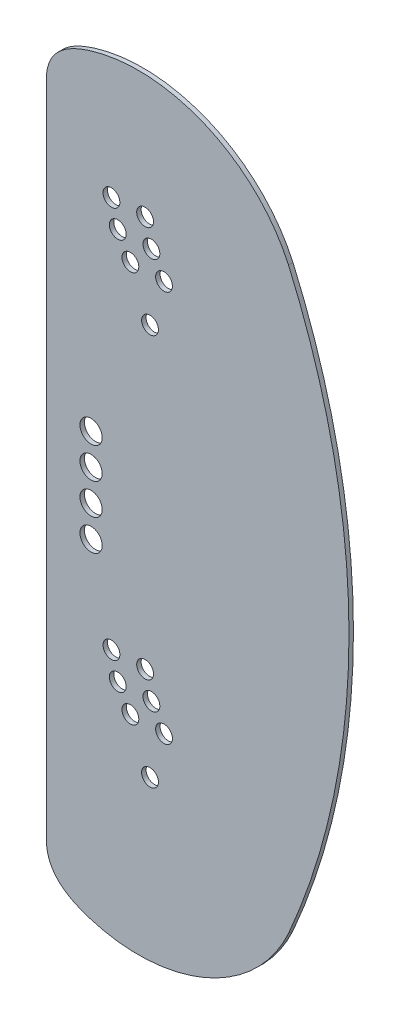
ISO-10303-21;
HEADER;
FILE_DESCRIPTION(('STEP AP214'),'2;1');
FILE_NAME('part.step','',(''),(''),'','','');
FILE_SCHEMA(('AUTOMOTIVE_DESIGN { 1 0 10303 214 1 1 1 1 }'));
ENDSEC;
DATA;
#1=APPLICATION_CONTEXT('core data for automotive mechanical design processes');
#2=APPLICATION_PROTOCOL_DEFINITION('international standard','automotive_design',2000,#1);
#3=PRODUCT_CONTEXT('',#1,'mechanical');
#4=PRODUCT('Part','Part','',(#3));
#5=PRODUCT_RELATED_PRODUCT_CATEGORY('part','',(#4));
#6=PRODUCT_DEFINITION_FORMATION('','',#4);
#7=PRODUCT_DEFINITION_CONTEXT('part definition',#1,'design');
#8=PRODUCT_DEFINITION('design','',#6,#7);
#9=PRODUCT_DEFINITION_SHAPE('','',#8);
#10=(LENGTH_UNIT() NAMED_UNIT(*) SI_UNIT(.MILLI.,.METRE.));
#11=(NAMED_UNIT(*) PLANE_ANGLE_UNIT() SI_UNIT($,.RADIAN.));
#12=(NAMED_UNIT(*) SI_UNIT($,.STERADIAN.) SOLID_ANGLE_UNIT());
#13=UNCERTAINTY_MEASURE_WITH_UNIT(LENGTH_MEASURE(1.E-05),#10,'distance_accuracy_value','');
#14=(GEOMETRIC_REPRESENTATION_CONTEXT(3) GLOBAL_UNCERTAINTY_ASSIGNED_CONTEXT((#13)) GLOBAL_UNIT_ASSIGNED_CONTEXT((#10,
#11,#12)) REPRESENTATION_CONTEXT('',''));
#15=CARTESIAN_POINT('',(0.,0.,0.));
#16=DIRECTION('',(0.,0.,1.));
#17=DIRECTION('',(1.,0.,0.));
#18=AXIS2_PLACEMENT_3D('',#15,#16,#17);
#19=CARTESIAN_POINT('',(1361.09656167217,1948.86349417425,6.35));
#20=CARTESIAN_POINT('',(1364.40082784819,1984.02317107155,6.35));
#21=CARTESIAN_POINT('',(1498.61321106589,2056.46227725234,6.35));
#22=CARTESIAN_POINT('',(1658.30760281048,1990.65488029267,6.35));
#23=CARTESIAN_POINT('',(1706.23606502377,1885.5492461219,6.35));
#24=B_SPLINE_CURVE_WITH_KNOTS('',3,(#19,#20,#21,#22,#23),.UNSPECIFIED.,.F.,.F.,(4,1,4),(0.,
0.219674410916332,1.),.UNSPECIFIED.);
#25=DIRECTION('',(0.,0.,-1.));
#26=VECTOR('',#25,1.);
#27=SURFACE_OF_LINEAR_EXTRUSION('',#24,#26);
#28=CARTESIAN_POINT('',(1361.09656167217,1948.86349417425,0.));
#29=CARTESIAN_POINT('',(1364.40082784819,1984.02317107155,0.));
#30=CARTESIAN_POINT('',(1498.61321106589,2056.46227725234,0.));
#31=CARTESIAN_POINT('',(1658.30760281048,1990.65488029267,0.));
#32=CARTESIAN_POINT('',(1706.23606502377,1885.5492461219,0.));
#33=B_SPLINE_CURVE_WITH_KNOTS('',3,(#28,#29,#30,#31,#32),.UNSPECIFIED.,.F.,.F.,(4,1,4),(0.,
0.219674410916332,1.),.UNSPECIFIED.);
#34=CARTESIAN_POINT('',(1361.09656167217,1948.86349417425,0.));
#35=VERTEX_POINT('',#34);
#36=CARTESIAN_POINT('',(1706.23606502377,1885.5492461219,0.));
#37=VERTEX_POINT('',#36);
#38=EDGE_CURVE('E116',#35,#37,#33,.T.);
#39=ORIENTED_EDGE('',*,*,#38,.F.);
#40=DIRECTION('',(0.,0.,-1.));
#41=VECTOR('',#40,1.);
#42=CARTESIAN_POINT('',(1361.09656167217,1948.86349417425,6.35));
#43=LINE('',#42,#41);
#44=CARTESIAN_POINT('',(1361.09656167217,1948.86349417425,6.35));
#45=VERTEX_POINT('',#44);
#46=EDGE_CURVE('E11',#45,#35,#43,.T.);
#47=ORIENTED_EDGE('',*,*,#46,.F.);
#48=CARTESIAN_POINT('',(1706.23606502377,1885.5492461219,6.35));
#49=VERTEX_POINT('',#48);
#50=EDGE_CURVE('E85',#45,#49,#24,.T.);
#51=ORIENTED_EDGE('',*,*,#50,.T.);
#52=DIRECTION('',(0.,0.,-1.));
#53=VECTOR('',#52,1.);
#54=CARTESIAN_POINT('',(1706.23606502377,1885.5492461219,6.35));
#55=LINE('',#54,#53);
#56=EDGE_CURVE('E73',#49,#37,#55,.T.);
#57=ORIENTED_EDGE('',*,*,#56,.T.);
#58=EDGE_LOOP('',(#39,#47,#51,#57));
#59=FACE_BOUND('',#58,.T.);
#60=ADVANCED_FACE('F33',(#59),#27,.T.);
#61=CARTESIAN_POINT('',(1361.09656167217,0.,6.35));
#62=DIRECTION('',(1.,0.,0.));
#63=DIRECTION('',(0.,0.,-1.));
#64=AXIS2_PLACEMENT_3D('',#61,#62,#63);
#65=PLANE('',#64);
#66=DIRECTION('',(0.,-1.,0.));
#67=VECTOR('',#66,1.);
#68=CARTESIAN_POINT('',(1361.09656167217,0.,0.));
#69=LINE('',#68,#67);
#70=CARTESIAN_POINT('',(1361.09656167217,996.36349417552,0.));
#71=VERTEX_POINT('',#70);
#72=EDGE_CURVE('E90',#35,#71,#69,.T.);
#73=ORIENTED_EDGE('',*,*,#72,.T.);
#74=DIRECTION('',(0.,0.,-1.));
#75=VECTOR('',#74,1.);
#76=CARTESIAN_POINT('',(1361.09656167217,996.36349417552,6.35));
#77=LINE('',#76,#75);
#78=CARTESIAN_POINT('',(1361.09656167217,996.36349417552,6.35));
#79=VERTEX_POINT('',#78);
#80=EDGE_CURVE('E42',#79,#71,#77,.T.);
#81=ORIENTED_EDGE('',*,*,#80,.F.);
#82=DIRECTION('',(0.,-1.,0.));
#83=VECTOR('',#82,1.);
#84=CARTESIAN_POINT('',(1361.09656167217,0.,6.35));
#85=LINE('',#84,#83);
#86=EDGE_CURVE('E79',#45,#79,#85,.T.);
#87=ORIENTED_EDGE('',*,*,#86,.F.);
#88=ORIENTED_EDGE('',*,*,#46,.T.);
#89=EDGE_LOOP('',(#73,#81,#87,#88));
#90=FACE_BOUND('',#89,.T.);
#91=ADVANCED_FACE('F88',(#90),#65,.F.);
#92=CARTESIAN_POINT('',(1361.09656167217,996.36349417552,6.35));
#93=CARTESIAN_POINT('',(1364.40082784819,961.20381727822,6.35));
#94=CARTESIAN_POINT('',(1498.61321106589,888.764711097435,6.35));
#95=CARTESIAN_POINT('',(1658.30760281048,954.572108057104,6.35));
#96=CARTESIAN_POINT('',(1706.23606502377,1059.67774222787,6.35));
#97=B_SPLINE_CURVE_WITH_KNOTS('',3,(#92,#93,#94,#95,#96),.UNSPECIFIED.,.F.,.F.,(4,1,4),(0.,
0.219674410916332,1.),.UNSPECIFIED.);
#98=DIRECTION('',(0.,0.,-1.));
#99=VECTOR('',#98,1.);
#100=SURFACE_OF_LINEAR_EXTRUSION('',#97,#99);
#101=CARTESIAN_POINT('',(1361.09656167217,996.36349417552,0.));
#102=CARTESIAN_POINT('',(1364.40082784819,961.20381727822,0.));
#103=CARTESIAN_POINT('',(1498.61321106589,888.764711097435,0.));
#104=CARTESIAN_POINT('',(1658.30760281048,954.572108057104,0.));
#105=CARTESIAN_POINT('',(1706.23606502377,1059.67774222787,0.));
#106=B_SPLINE_CURVE_WITH_KNOTS('',3,(#101,#102,#103,#104,#105),.UNSPECIFIED.,.F.,.F.,(4,1,4),
(0.,0.219674410916332,1.),.UNSPECIFIED.);
#107=CARTESIAN_POINT('',(1706.23606502377,1059.67774222787,0.));
#108=VERTEX_POINT('',#107);
#109=EDGE_CURVE('E66',#71,#108,#106,.T.);
#110=ORIENTED_EDGE('',*,*,#109,.T.);
#111=DIRECTION('',(0.,0.,-1.));
#112=VECTOR('',#111,1.);
#113=CARTESIAN_POINT('',(1706.23606502377,1059.67774222787,6.35));
#114=LINE('',#113,#112);
#115=CARTESIAN_POINT('',(1706.23606502377,1059.67774222787,6.35));
#116=VERTEX_POINT('',#115);
#117=EDGE_CURVE('E91',#116,#108,#114,.T.);
#118=ORIENTED_EDGE('',*,*,#117,.F.);
#119=EDGE_CURVE('E84',#79,#116,#97,.T.);
#120=ORIENTED_EDGE('',*,*,#119,.F.);
#121=ORIENTED_EDGE('',*,*,#80,.T.);
#122=EDGE_LOOP('',(#110,#118,#120,#121));
#123=FACE_BOUND('',#122,.T.);
#124=ADVANCED_FACE('F92',(#123),#100,.F.);
#125=CARTESIAN_POINT('',(1462.66490862887,1248.81453875202,6.35));
#126=DIRECTION('',(0.,0.,-1.));
#127=DIRECTION('',(-1.,0.,0.));
#128=AXIS2_PLACEMENT_3D('',#125,#126,#127);
#129=CYLINDRICAL_SURFACE('',#128,12.0000014000006);
#130=CARTESIAN_POINT('',(1462.66490862887,1248.81453875202,6.35));
#131=DIRECTION('',(0.,0.,1.));
#132=DIRECTION('',(1.,0.,0.));
#133=AXIS2_PLACEMENT_3D('',#130,#131,#132);
#134=CIRCLE('',#133,12.0000014000006);
#135=CARTESIAN_POINT('',(1474.66491002887,1248.81453875202,6.35));
#136=VERTEX_POINT('',#135);
#137=EDGE_CURVE('E360',#136,#136,#134,.T.);
#138=ORIENTED_EDGE('',*,*,#137,.T.);
#139=EDGE_LOOP('',(#138));
#140=FACE_BOUND('',#139,.T.);
#141=CARTESIAN_POINT('',(1462.66490862887,1248.81453875202,0.));
#142=DIRECTION('',(0.,0.,1.));
#143=DIRECTION('',(1.,0.,0.));
#144=AXIS2_PLACEMENT_3D('',#141,#142,#143);
#145=CIRCLE('',#144,12.0000014000006);
#146=CARTESIAN_POINT('',(1474.66491002887,1248.81453875202,0.));
#147=VERTEX_POINT('',#146);
#148=EDGE_CURVE('E186',#147,#147,#145,.T.);
#149=ORIENTED_EDGE('',*,*,#148,.F.);
#150=EDGE_LOOP('',(#149));
#151=FACE_BOUND('',#150,.T.);
#152=ADVANCED_FACE('F106',(#140,#151),#129,.F.);
#153=CARTESIAN_POINT('',(1508.66437512587,1153.81451282817,6.35));
#154=DIRECTION('',(0.,0.,-1.));
#155=DIRECTION('',(-1.,0.,0.));
#156=AXIS2_PLACEMENT_3D('',#153,#154,#155);
#157=CYLINDRICAL_SURFACE('',#156,12.0000014);
#158=CARTESIAN_POINT('',(1508.66437512587,1153.81451282817,6.35));
#159=DIRECTION('',(0.,0.,1.));
#160=DIRECTION('',(1.,0.,0.));
#161=AXIS2_PLACEMENT_3D('',#158,#159,#160);
#162=CIRCLE('',#161,12.0000014);
#163=CARTESIAN_POINT('',(1520.66437652587,1153.81451282817,6.35));
#164=VERTEX_POINT('',#163);
#165=EDGE_CURVE('E358',#164,#164,#162,.T.);
#166=ORIENTED_EDGE('',*,*,#165,.T.);
#167=EDGE_LOOP('',(#166));
#168=FACE_BOUND('',#167,.T.);
#169=CARTESIAN_POINT('',(1508.66437512587,1153.81451282817,0.));
#170=DIRECTION('',(0.,0.,1.));
#171=DIRECTION('',(1.,0.,0.));
#172=AXIS2_PLACEMENT_3D('',#169,#170,#171);
#173=CIRCLE('',#172,12.0000014);
#174=CARTESIAN_POINT('',(1520.66437652587,1153.81451282817,0.));
#175=VERTEX_POINT('',#174);
#176=EDGE_CURVE('E183',#175,#175,#173,.T.);
#177=ORIENTED_EDGE('',*,*,#176,.F.);
#178=EDGE_LOOP('',(#177));
#179=FACE_BOUND('',#178,.T.);
#180=ADVANCED_FACE('F248',(#168,#179),#157,.F.);
#181=CARTESIAN_POINT('',(1508.66437512587,1712.61451282817,6.35));
#182=DIRECTION('',(0.,0.,-1.));
#183=DIRECTION('',(-1.,0.,0.));
#184=AXIS2_PLACEMENT_3D('',#181,#182,#183);
#185=CYLINDRICAL_SURFACE('',#184,12.0000014);
#186=CARTESIAN_POINT('',(1508.66437512587,1712.61451282817,6.35));
#187=DIRECTION('',(0.,0.,1.));
#188=DIRECTION('',(1.,0.,0.));
#189=AXIS2_PLACEMENT_3D('',#186,#187,#188);
#190=CIRCLE('',#189,12.0000014);
#191=CARTESIAN_POINT('',(1520.66437652587,1712.61451282817,6.35));
#192=VERTEX_POINT('',#191);
#193=EDGE_CURVE('E355',#192,#192,#190,.T.);
#194=ORIENTED_EDGE('',*,*,#193,.T.);
#195=EDGE_LOOP('',(#194));
#196=FACE_BOUND('',#195,.T.);
#197=CARTESIAN_POINT('',(1508.66437512587,1712.61451282817,0.));
#198=DIRECTION('',(0.,0.,1.));
#199=DIRECTION('',(1.,0.,0.));
#200=AXIS2_PLACEMENT_3D('',#197,#198,#199);
#201=CIRCLE('',#200,12.0000014);
#202=CARTESIAN_POINT('',(1520.66437652587,1712.61451282817,0.));
#203=VERTEX_POINT('',#202);
#204=EDGE_CURVE('E180',#203,#203,#201,.T.);
#205=ORIENTED_EDGE('',*,*,#204,.F.);
#206=EDGE_LOOP('',(#205));
#207=FACE_BOUND('',#206,.T.);
#208=ADVANCED_FACE('F252',(#196,#207),#185,.F.);
#209=CARTESIAN_POINT('',(1453.66490122887,1283.81446875202,6.35));
#210=DIRECTION('',(0.,0.,-1.));
#211=DIRECTION('',(-1.,0.,0.));
#212=AXIS2_PLACEMENT_3D('',#209,#210,#211);
#213=CYLINDRICAL_SURFACE('',#212,12.0000014000006);
#214=CARTESIAN_POINT('',(1453.66490122887,1283.81446875202,6.35));
#215=DIRECTION('',(0.,0.,1.));
#216=DIRECTION('',(1.,0.,0.));
#217=AXIS2_PLACEMENT_3D('',#214,#215,#216);
#218=CIRCLE('',#217,12.0000014000006);
#219=CARTESIAN_POINT('',(1465.66490262887,1283.81446875202,6.35));
#220=VERTEX_POINT('',#219);
#221=EDGE_CURVE('E352',#220,#220,#218,.T.);
#222=ORIENTED_EDGE('',*,*,#221,.T.);
#223=EDGE_LOOP('',(#222));
#224=FACE_BOUND('',#223,.T.);
#225=CARTESIAN_POINT('',(1453.66490122887,1283.81446875202,0.));
#226=DIRECTION('',(0.,0.,1.));
#227=DIRECTION('',(1.,0.,0.));
#228=AXIS2_PLACEMENT_3D('',#225,#226,#227);
#229=CIRCLE('',#228,12.0000014000006);
#230=CARTESIAN_POINT('',(1465.66490262887,1283.81446875202,0.));
#231=VERTEX_POINT('',#230);
#232=EDGE_CURVE('E177',#231,#231,#229,.T.);
#233=ORIENTED_EDGE('',*,*,#232,.F.);
#234=EDGE_LOOP('',(#233));
#235=FACE_BOUND('',#234,.T.);
#236=ADVANCED_FACE('F256',(#224,#235),#213,.F.);
#237=CARTESIAN_POINT('',(1528.66490132569,1217.56456298125,6.35));
#238=DIRECTION('',(0.,0.,-1.));
#239=DIRECTION('',(-1.,0.,0.));
#240=AXIS2_PLACEMENT_3D('',#237,#238,#239);
#241=CYLINDRICAL_SURFACE('',#240,12.0000013999997);
#242=CARTESIAN_POINT('',(1528.66490132569,1217.56456298125,6.35));
#243=DIRECTION('',(0.,0.,1.));
#244=DIRECTION('',(1.,0.,0.));
#245=AXIS2_PLACEMENT_3D('',#242,#243,#244);
#246=CIRCLE('',#245,12.0000013999997);
#247=CARTESIAN_POINT('',(1540.66490272569,1217.56456298125,6.35));
#248=VERTEX_POINT('',#247);
#249=EDGE_CURVE('E349',#248,#248,#246,.T.);
#250=ORIENTED_EDGE('',*,*,#249,.T.);
#251=EDGE_LOOP('',(#250));
#252=FACE_BOUND('',#251,.T.);
#253=CARTESIAN_POINT('',(1528.66490132569,1217.56456298125,0.));
#254=DIRECTION('',(0.,0.,1.));
#255=DIRECTION('',(1.,0.,0.));
#256=AXIS2_PLACEMENT_3D('',#253,#254,#255);
#257=CIRCLE('',#256,12.0000013999997);
#258=CARTESIAN_POINT('',(1540.66490272569,1217.56456298125,0.));
#259=VERTEX_POINT('',#258);
#260=EDGE_CURVE('E174',#259,#259,#257,.T.);
#261=ORIENTED_EDGE('',*,*,#260,.F.);
#262=EDGE_LOOP('',(#261));
#263=FACE_BOUND('',#262,.T.);
#264=ADVANCED_FACE('F260',(#252,#263),#241,.F.);
#265=CARTESIAN_POINT('',(1480.66497025827,1217.56456298125,6.35));
#266=DIRECTION('',(0.,0.,-1.));
#267=DIRECTION('',(-1.,0.,0.));
#268=AXIS2_PLACEMENT_3D('',#265,#266,#267);
#269=CYLINDRICAL_SURFACE('',#268,12.0000013999997);
#270=CARTESIAN_POINT('',(1480.66497025827,1217.56456298125,6.35));
#271=DIRECTION('',(0.,0.,1.));
#272=DIRECTION('',(1.,0.,0.));
#273=AXIS2_PLACEMENT_3D('',#270,#271,#272);
#274=CIRCLE('',#273,12.0000013999997);
#275=CARTESIAN_POINT('',(1492.66497165827,1217.56456298125,6.35));
#276=VERTEX_POINT('',#275);
#277=EDGE_CURVE('E346',#276,#276,#274,.T.);
#278=ORIENTED_EDGE('',*,*,#277,.T.);
#279=EDGE_LOOP('',(#278));
#280=FACE_BOUND('',#279,.T.);
#281=CARTESIAN_POINT('',(1480.66497025827,1217.56456298125,0.));
#282=DIRECTION('',(0.,0.,1.));
#283=DIRECTION('',(1.,0.,0.));
#284=AXIS2_PLACEMENT_3D('',#281,#282,#283);
#285=CIRCLE('',#284,12.0000013999997);
#286=CARTESIAN_POINT('',(1492.66497165827,1217.56456298125,0.));
#287=VERTEX_POINT('',#286);
#288=EDGE_CURVE('E171',#287,#287,#285,.T.);
#289=ORIENTED_EDGE('',*,*,#288,.F.);
#290=EDGE_LOOP('',(#289));
#291=FACE_BOUND('',#290,.T.);
#292=ADVANCED_FACE('F264',(#280,#291),#269,.F.);
#293=CARTESIAN_POINT('',(1501.66489712587,1283.81450682817,6.35));
#294=DIRECTION('',(0.,0.,-1.));
#295=DIRECTION('',(-1.,0.,0.));
#296=AXIS2_PLACEMENT_3D('',#293,#294,#295);
#297=CYLINDRICAL_SURFACE('',#296,12.0000013999997);
#298=CARTESIAN_POINT('',(1501.66489712587,1283.81450682817,6.35));
#299=DIRECTION('',(0.,0.,1.));
#300=DIRECTION('',(1.,0.,0.));
#301=AXIS2_PLACEMENT_3D('',#298,#299,#300);
#302=CIRCLE('',#301,12.0000013999997);
#303=CARTESIAN_POINT('',(1513.66489852587,1283.81450682817,6.35));
#304=VERTEX_POINT('',#303);
#305=EDGE_CURVE('E343',#304,#304,#302,.T.);
#306=ORIENTED_EDGE('',*,*,#305,.T.);
#307=EDGE_LOOP('',(#306));
#308=FACE_BOUND('',#307,.T.);
#309=CARTESIAN_POINT('',(1501.66489712587,1283.81450682817,0.));
#310=DIRECTION('',(0.,0.,1.));
#311=DIRECTION('',(1.,0.,0.));
#312=AXIS2_PLACEMENT_3D('',#309,#310,#311);
#313=CIRCLE('',#312,12.0000013999997);
#314=CARTESIAN_POINT('',(1513.66489852587,1283.81450682817,0.));
#315=VERTEX_POINT('',#314);
#316=EDGE_CURVE('E168',#315,#315,#313,.T.);
#317=ORIENTED_EDGE('',*,*,#316,.F.);
#318=EDGE_LOOP('',(#317));
#319=FACE_BOUND('',#318,.T.);
#320=ADVANCED_FACE('F268',(#308,#319),#297,.F.);
#321=CARTESIAN_POINT('',(1424.59656167217,1539.28849417425,6.35));
#322=DIRECTION('',(0.,0.,-1.));
#323=DIRECTION('',(-1.,0.,0.));
#324=AXIS2_PLACEMENT_3D('',#321,#322,#323);
#325=CYLINDRICAL_SURFACE('',#324,15.8750000000002);
#326=CARTESIAN_POINT('',(1424.59656167217,1539.28849417425,6.35));
#327=DIRECTION('',(0.,0.,1.));
#328=DIRECTION('',(1.,0.,0.));
#329=AXIS2_PLACEMENT_3D('',#326,#327,#328);
#330=CIRCLE('',#329,15.8750000000002);
#331=CARTESIAN_POINT('',(1440.47156167217,1539.28849417425,6.35));
#332=VERTEX_POINT('',#331);
#333=EDGE_CURVE('E340',#332,#332,#330,.T.);
#334=ORIENTED_EDGE('',*,*,#333,.T.);
#335=EDGE_LOOP('',(#334));
#336=FACE_BOUND('',#335,.T.);
#337=CARTESIAN_POINT('',(1424.59656167217,1539.28849417425,0.));
#338=DIRECTION('',(0.,0.,1.));
#339=DIRECTION('',(1.,0.,0.));
#340=AXIS2_PLACEMENT_3D('',#337,#338,#339);
#341=CIRCLE('',#340,15.8750000000002);
#342=CARTESIAN_POINT('',(1440.47156167217,1539.28849417425,0.));
#343=VERTEX_POINT('',#342);
#344=EDGE_CURVE('E165',#343,#343,#341,.T.);
#345=ORIENTED_EDGE('',*,*,#344,.F.);
#346=EDGE_LOOP('',(#345));
#347=FACE_BOUND('',#346,.T.);
#348=ADVANCED_FACE('F272',(#336,#347),#325,.F.);
#349=CARTESIAN_POINT('',(1424.59656167217,1494.83849417425,6.35));
#350=DIRECTION('',(0.,0.,-1.));
#351=DIRECTION('',(-1.,0.,0.));
#352=AXIS2_PLACEMENT_3D('',#349,#350,#351);
#353=CYLINDRICAL_SURFACE('',#352,15.8750000000002);
#354=CARTESIAN_POINT('',(1424.59656167217,1494.83849417425,6.35));
#355=DIRECTION('',(0.,0.,1.));
#356=DIRECTION('',(1.,0.,0.));
#357=AXIS2_PLACEMENT_3D('',#354,#355,#356);
#358=CIRCLE('',#357,15.8750000000002);
#359=CARTESIAN_POINT('',(1440.47156167217,1494.83849417425,6.35));
#360=VERTEX_POINT('',#359);
#361=EDGE_CURVE('E337',#360,#360,#358,.T.);
#362=ORIENTED_EDGE('',*,*,#361,.T.);
#363=EDGE_LOOP('',(#362));
#364=FACE_BOUND('',#363,.T.);
#365=CARTESIAN_POINT('',(1424.59656167217,1494.83849417425,0.));
#366=DIRECTION('',(0.,0.,1.));
#367=DIRECTION('',(1.,0.,0.));
#368=AXIS2_PLACEMENT_3D('',#365,#366,#367);
#369=CIRCLE('',#368,15.8750000000002);
#370=CARTESIAN_POINT('',(1440.47156167217,1494.83849417425,0.));
#371=VERTEX_POINT('',#370);
#372=EDGE_CURVE('E162',#371,#371,#369,.T.);
#373=ORIENTED_EDGE('',*,*,#372,.F.);
#374=EDGE_LOOP('',(#373));
#375=FACE_BOUND('',#374,.T.);
#376=ADVANCED_FACE('F276',(#364,#375),#353,.F.);
#377=CARTESIAN_POINT('',(1424.59656167217,1450.38849417425,6.35));
#378=DIRECTION('',(0.,0.,-1.));
#379=DIRECTION('',(-1.,0.,0.));
#380=AXIS2_PLACEMENT_3D('',#377,#378,#379);
#381=CYLINDRICAL_SURFACE('',#380,15.8750000000002);
#382=CARTESIAN_POINT('',(1424.59656167217,1450.38849417425,6.35));
#383=DIRECTION('',(0.,0.,1.));
#384=DIRECTION('',(1.,0.,0.));
#385=AXIS2_PLACEMENT_3D('',#382,#383,#384);
#386=CIRCLE('',#385,15.8750000000002);
#387=CARTESIAN_POINT('',(1440.47156167217,1450.38849417425,6.35));
#388=VERTEX_POINT('',#387);
#389=EDGE_CURVE('E334',#388,#388,#386,.T.);
#390=ORIENTED_EDGE('',*,*,#389,.T.);
#391=EDGE_LOOP('',(#390));
#392=FACE_BOUND('',#391,.T.);
#393=CARTESIAN_POINT('',(1424.59656167217,1450.38849417425,0.));
#394=DIRECTION('',(0.,0.,1.));
#395=DIRECTION('',(1.,0.,0.));
#396=AXIS2_PLACEMENT_3D('',#393,#394,#395);
#397=CIRCLE('',#396,15.8750000000002);
#398=CARTESIAN_POINT('',(1440.47156167217,1450.38849417425,0.));
#399=VERTEX_POINT('',#398);
#400=EDGE_CURVE('E159',#399,#399,#397,.T.);
#401=ORIENTED_EDGE('',*,*,#400,.F.);
#402=EDGE_LOOP('',(#401));
#403=FACE_BOUND('',#402,.T.);
#404=ADVANCED_FACE('F280',(#392,#403),#381,.F.);
#405=CARTESIAN_POINT('',(1424.59656167217,1405.93849417425,6.35));
#406=DIRECTION('',(0.,0.,-1.));
#407=DIRECTION('',(-1.,0.,0.));
#408=AXIS2_PLACEMENT_3D('',#405,#406,#407);
#409=CYLINDRICAL_SURFACE('',#408,15.8750000000002);
#410=CARTESIAN_POINT('',(1424.59656167217,1405.93849417425,6.35));
#411=DIRECTION('',(0.,0.,1.));
#412=DIRECTION('',(1.,0.,0.));
#413=AXIS2_PLACEMENT_3D('',#410,#411,#412);
#414=CIRCLE('',#413,15.8750000000002);
#415=CARTESIAN_POINT('',(1440.47156167217,1405.93849417425,6.35));
#416=VERTEX_POINT('',#415);
#417=EDGE_CURVE('E331',#416,#416,#414,.T.);
#418=ORIENTED_EDGE('',*,*,#417,.T.);
#419=EDGE_LOOP('',(#418));
#420=FACE_BOUND('',#419,.T.);
#421=CARTESIAN_POINT('',(1424.59656167217,1405.93849417425,0.));
#422=DIRECTION('',(0.,0.,1.));
#423=DIRECTION('',(1.,0.,0.));
#424=AXIS2_PLACEMENT_3D('',#421,#422,#423);
#425=CIRCLE('',#424,15.8750000000002);
#426=CARTESIAN_POINT('',(1440.47156167217,1405.93849417425,0.));
#427=VERTEX_POINT('',#426);
#428=EDGE_CURVE('E156',#427,#427,#425,.T.);
#429=ORIENTED_EDGE('',*,*,#428,.F.);
#430=EDGE_LOOP('',(#429));
#431=FACE_BOUND('',#430,.T.);
#432=ADVANCED_FACE('F284',(#420,#431),#409,.F.);
#433=CARTESIAN_POINT('',(1501.66489712587,1842.61450682817,6.35));
#434=DIRECTION('',(0.,0.,-1.));
#435=DIRECTION('',(-1.,0.,0.));
#436=AXIS2_PLACEMENT_3D('',#433,#434,#435);
#437=CYLINDRICAL_SURFACE('',#436,12.0000013999997);
#438=CARTESIAN_POINT('',(1501.66489712587,1842.61450682817,6.35));
#439=DIRECTION('',(0.,0.,1.));
#440=DIRECTION('',(1.,0.,0.));
#441=AXIS2_PLACEMENT_3D('',#438,#439,#440);
#442=CIRCLE('',#441,12.0000013999997);
#443=CARTESIAN_POINT('',(1513.66489852587,1842.61450682817,6.35));
#444=VERTEX_POINT('',#443);
#445=EDGE_CURVE('E328',#444,#444,#442,.T.);
#446=ORIENTED_EDGE('',*,*,#445,.T.);
#447=EDGE_LOOP('',(#446));
#448=FACE_BOUND('',#447,.T.);
#449=CARTESIAN_POINT('',(1501.66489712587,1842.61450682817,0.));
#450=DIRECTION('',(0.,0.,1.));
#451=DIRECTION('',(1.,0.,0.));
#452=AXIS2_PLACEMENT_3D('',#449,#450,#451);
#453=CIRCLE('',#452,12.0000013999997);
#454=CARTESIAN_POINT('',(1513.66489852587,1842.61450682817,0.));
#455=VERTEX_POINT('',#454);
#456=EDGE_CURVE('E153',#455,#455,#453,.T.);
#457=ORIENTED_EDGE('',*,*,#456,.F.);
#458=EDGE_LOOP('',(#457));
#459=FACE_BOUND('',#458,.T.);
#460=ADVANCED_FACE('F288',(#448,#459),#437,.F.);
#461=CARTESIAN_POINT('',(1510.66490452587,1807.61457682817,6.35));
#462=DIRECTION('',(0.,0.,-1.));
#463=DIRECTION('',(-1.,0.,0.));
#464=AXIS2_PLACEMENT_3D('',#461,#462,#463);
#465=CYLINDRICAL_SURFACE('',#464,12.0000013999997);
#466=CARTESIAN_POINT('',(1510.66490452587,1807.61457682817,6.35));
#467=DIRECTION('',(0.,0.,1.));
#468=DIRECTION('',(1.,0.,0.));
#469=AXIS2_PLACEMENT_3D('',#466,#467,#468);
#470=CIRCLE('',#469,12.0000013999997);
#471=CARTESIAN_POINT('',(1522.66490592587,1807.61457682817,6.35));
#472=VERTEX_POINT('',#471);
#473=EDGE_CURVE('E325',#472,#472,#470,.T.);
#474=ORIENTED_EDGE('',*,*,#473,.T.);
#475=EDGE_LOOP('',(#474));
#476=FACE_BOUND('',#475,.T.);
#477=CARTESIAN_POINT('',(1510.66490452587,1807.61457682817,0.));
#478=DIRECTION('',(0.,0.,1.));
#479=DIRECTION('',(1.,0.,0.));
#480=AXIS2_PLACEMENT_3D('',#477,#478,#479);
#481=CIRCLE('',#480,12.0000013999997);
#482=CARTESIAN_POINT('',(1522.66490592587,1807.61457682817,0.));
#483=VERTEX_POINT('',#482);
#484=EDGE_CURVE('E150',#483,#483,#481,.T.);
#485=ORIENTED_EDGE('',*,*,#484,.F.);
#486=EDGE_LOOP('',(#485));
#487=FACE_BOUND('',#486,.T.);
#488=ADVANCED_FACE('F292',(#476,#487),#465,.F.);
#489=CARTESIAN_POINT('',(1528.66489392587,1776.36457582817,6.35));
#490=DIRECTION('',(0.,0.,-1.));
#491=DIRECTION('',(-1.,0.,0.));
#492=AXIS2_PLACEMENT_3D('',#489,#490,#491);
#493=CYLINDRICAL_SURFACE('',#492,12.0000013999997);
#494=CARTESIAN_POINT('',(1528.66489392587,1776.36457582817,6.35));
#495=DIRECTION('',(0.,0.,1.));
#496=DIRECTION('',(1.,0.,0.));
#497=AXIS2_PLACEMENT_3D('',#494,#495,#496);
#498=CIRCLE('',#497,12.0000013999997);
#499=CARTESIAN_POINT('',(1540.66489532587,1776.36457582817,6.35));
#500=VERTEX_POINT('',#499);
#501=EDGE_CURVE('E322',#500,#500,#498,.T.);
#502=ORIENTED_EDGE('',*,*,#501,.T.);
#503=EDGE_LOOP('',(#502));
#504=FACE_BOUND('',#503,.T.);
#505=CARTESIAN_POINT('',(1528.66489392587,1776.36457582817,0.));
#506=DIRECTION('',(0.,0.,1.));
#507=DIRECTION('',(1.,0.,0.));
#508=AXIS2_PLACEMENT_3D('',#505,#506,#507);
#509=CIRCLE('',#508,12.0000013999997);
#510=CARTESIAN_POINT('',(1540.66489532587,1776.36457582817,0.));
#511=VERTEX_POINT('',#510);
#512=EDGE_CURVE('E147',#511,#511,#509,.T.);
#513=ORIENTED_EDGE('',*,*,#512,.F.);
#514=EDGE_LOOP('',(#513));
#515=FACE_BOUND('',#514,.T.);
#516=ADVANCED_FACE('F296',(#504,#515),#493,.F.);
#517=CARTESIAN_POINT('',(1462.66497512587,1807.61457682817,6.35));
#518=DIRECTION('',(0.,0.,-1.));
#519=DIRECTION('',(-1.,0.,0.));
#520=AXIS2_PLACEMENT_3D('',#517,#518,#519);
#521=CYLINDRICAL_SURFACE('',#520,12.0000014000006);
#522=CARTESIAN_POINT('',(1462.66497512587,1807.61457682817,6.35));
#523=DIRECTION('',(0.,0.,1.));
#524=DIRECTION('',(1.,0.,0.));
#525=AXIS2_PLACEMENT_3D('',#522,#523,#524);
#526=CIRCLE('',#525,12.0000014000006);
#527=CARTESIAN_POINT('',(1474.66497652587,1807.61457682817,6.35));
#528=VERTEX_POINT('',#527);
#529=EDGE_CURVE('E317',#528,#528,#526,.T.);
#530=ORIENTED_EDGE('',*,*,#529,.T.);
#531=EDGE_LOOP('',(#530));
#532=FACE_BOUND('',#531,.T.);
#533=CARTESIAN_POINT('',(1462.66497512587,1807.61457682817,0.));
#534=DIRECTION('',(0.,0.,1.));
#535=DIRECTION('',(1.,0.,0.));
#536=AXIS2_PLACEMENT_3D('',#533,#534,#535);
#537=CIRCLE('',#536,12.0000014000006);
#538=CARTESIAN_POINT('',(1474.66497652587,1807.61457682817,0.));
#539=VERTEX_POINT('',#538);
#540=EDGE_CURVE('E144',#539,#539,#537,.T.);
#541=ORIENTED_EDGE('',*,*,#540,.F.);
#542=EDGE_LOOP('',(#541));
#543=FACE_BOUND('',#542,.T.);
#544=ADVANCED_FACE('F300',(#532,#543),#521,.F.);
#545=CARTESIAN_POINT('',(1480.6649289799,1776.3645553367,6.35));
#546=DIRECTION('',(0.,0.,-1.));
#547=DIRECTION('',(-1.,0.,0.));
#548=AXIS2_PLACEMENT_3D('',#545,#546,#547);
#549=CYLINDRICAL_SURFACE('',#548,11.9999603705492);
#550=CARTESIAN_POINT('',(1480.6649289799,1776.3645553367,6.35));
#551=DIRECTION('',(0.,0.,1.));
#552=DIRECTION('',(1.,0.,0.));
#553=AXIS2_PLACEMENT_3D('',#550,#551,#552);
#554=CIRCLE('',#553,11.9999603705492);
#555=CARTESIAN_POINT('',(1492.66488935045,1776.3645553367,6.35));
#556=VERTEX_POINT('',#555);
#557=EDGE_CURVE('E315',#556,#556,#554,.T.);
#558=ORIENTED_EDGE('',*,*,#557,.T.);
#559=EDGE_LOOP('',(#558));
#560=FACE_BOUND('',#559,.T.);
#561=CARTESIAN_POINT('',(1480.6649289799,1776.3645553367,0.));
#562=DIRECTION('',(0.,0.,1.));
#563=DIRECTION('',(1.,0.,0.));
#564=AXIS2_PLACEMENT_3D('',#561,#562,#563);
#565=CIRCLE('',#564,11.9999603705492);
#566=CARTESIAN_POINT('',(1492.66488935045,1776.3645553367,0.));
#567=VERTEX_POINT('',#566);
#568=EDGE_CURVE('E141',#567,#567,#565,.T.);
#569=ORIENTED_EDGE('',*,*,#568,.F.);
#570=EDGE_LOOP('',(#569));
#571=FACE_BOUND('',#570,.T.);
#572=ADVANCED_FACE('F304',(#560,#571),#549,.F.);
#573=CARTESIAN_POINT('',(1453.66496772587,1842.61450682817,6.35));
#574=DIRECTION('',(0.,0.,-1.));
#575=DIRECTION('',(-1.,0.,0.));
#576=AXIS2_PLACEMENT_3D('',#573,#574,#575);
#577=CYLINDRICAL_SURFACE('',#576,12.0000014000006);
#578=CARTESIAN_POINT('',(1453.66496772587,1842.61450682817,6.35));
#579=DIRECTION('',(0.,0.,1.));
#580=DIRECTION('',(1.,0.,0.));
#581=AXIS2_PLACEMENT_3D('',#578,#579,#580);
#582=CIRCLE('',#581,12.0000014000006);
#583=CARTESIAN_POINT('',(1465.66496912587,1842.61450682817,6.35));
#584=VERTEX_POINT('',#583);
#585=EDGE_CURVE('E94',#584,#584,#582,.T.);
#586=ORIENTED_EDGE('',*,*,#585,.T.);
#587=EDGE_LOOP('',(#586));
#588=FACE_BOUND('',#587,.T.);
#589=CARTESIAN_POINT('',(1453.66496772587,1842.61450682817,0.));
#590=DIRECTION('',(0.,0.,1.));
#591=DIRECTION('',(1.,0.,0.));
#592=AXIS2_PLACEMENT_3D('',#589,#590,#591);
#593=CIRCLE('',#592,12.0000014000006);
#594=CARTESIAN_POINT('',(1465.66496912587,1842.61450682817,0.));
#595=VERTEX_POINT('',#594);
#596=EDGE_CURVE('E138',#595,#595,#593,.T.);
#597=ORIENTED_EDGE('',*,*,#596,.F.);
#598=EDGE_LOOP('',(#597));
#599=FACE_BOUND('',#598,.T.);
#600=ADVANCED_FACE('F243',(#588,#599),#577,.F.);
#601=CARTESIAN_POINT('',(761.261648119075,1472.61349417489,6.35));
#602=DIRECTION('',(0.,0.,-1.));
#603=DIRECTION('',(-1.,0.,0.));
#604=AXIS2_PLACEMENT_3D('',#601,#602,#603);
#605=CYLINDRICAL_SURFACE('',#604,1031.25776789337);
#606=CARTESIAN_POINT('',(761.261648119075,1472.61349417489,0.));
#607=DIRECTION('',(0.,0.,1.));
#608=DIRECTION('',(1.,0.,0.));
#609=AXIS2_PLACEMENT_3D('',#606,#607,#608);
#610=CIRCLE('',#609,1031.25776789337);
#611=EDGE_CURVE('E133',#108,#37,#610,.T.);
#612=ORIENTED_EDGE('',*,*,#611,.T.);
#613=ORIENTED_EDGE('',*,*,#56,.F.);
#614=CARTESIAN_POINT('',(761.261648119075,1472.61349417489,6.35));
#615=DIRECTION('',(0.,0.,1.));
#616=DIRECTION('',(1.,0.,0.));
#617=AXIS2_PLACEMENT_3D('',#614,#615,#616);
#618=CIRCLE('',#617,1031.25776789337);
#619=EDGE_CURVE('E50',#116,#49,#618,.T.);
#620=ORIENTED_EDGE('',*,*,#619,.F.);
#621=ORIENTED_EDGE('',*,*,#117,.T.);
#622=EDGE_LOOP('',(#612,#613,#620,#621));
#623=FACE_BOUND('',#622,.T.);
#624=ADVANCED_FACE('F107',(#623),#605,.T.);
#625=CARTESIAN_POINT('',(1510.66490452587,1248.81457682817,6.35));
#626=DIRECTION('',(0.,0.,-1.));
#627=DIRECTION('',(-1.,0.,0.));
#628=AXIS2_PLACEMENT_3D('',#625,#626,#627);
#629=CYLINDRICAL_SURFACE('',#628,12.0000013999997);
#630=CARTESIAN_POINT('',(1510.66490452587,1248.81457682817,6.35));
#631=DIRECTION('',(0.,0.,1.));
#632=DIRECTION('',(1.,0.,0.));
#633=AXIS2_PLACEMENT_3D('',#630,#631,#632);
#634=CIRCLE('',#633,12.0000013999997);
#635=CARTESIAN_POINT('',(1522.66490592587,1248.81457682817,6.35));
#636=VERTEX_POINT('',#635);
#637=EDGE_CURVE('E124',#636,#636,#634,.T.);
#638=ORIENTED_EDGE('',*,*,#637,.T.);
#639=EDGE_LOOP('',(#638));
#640=FACE_BOUND('',#639,.T.);
#641=CARTESIAN_POINT('',(1510.66490452587,1248.81457682817,0.));
#642=DIRECTION('',(0.,0.,1.));
#643=DIRECTION('',(1.,0.,0.));
#644=AXIS2_PLACEMENT_3D('',#641,#642,#643);
#645=CIRCLE('',#644,12.0000013999997);
#646=CARTESIAN_POINT('',(1522.66490592587,1248.81457682817,0.));
#647=VERTEX_POINT('',#646);
#648=EDGE_CURVE('E189',#647,#647,#645,.T.);
#649=ORIENTED_EDGE('',*,*,#648,.F.);
#650=EDGE_LOOP('',(#649));
#651=FACE_BOUND('',#650,.T.);
#652=ADVANCED_FACE('F234',(#640,#651),#629,.F.);
#653=CARTESIAN_POINT('',(0.,0.,6.35));
#654=DIRECTION('',(0.,0.,1.));
#655=DIRECTION('',(1.,0.,0.));
#656=AXIS2_PLACEMENT_3D('',#653,#654,#655);
#657=PLANE('',#656);
#658=ORIENTED_EDGE('',*,*,#50,.F.);
#659=ORIENTED_EDGE('',*,*,#86,.T.);
#660=ORIENTED_EDGE('',*,*,#119,.T.);
#661=ORIENTED_EDGE('',*,*,#619,.T.);
#662=EDGE_LOOP('',(#658,#659,#660,#661));
#663=FACE_BOUND('',#662,.T.);
#664=ORIENTED_EDGE('',*,*,#585,.F.);
#665=EDGE_LOOP('',(#664));
#666=FACE_BOUND('',#665,.T.);
#667=ORIENTED_EDGE('',*,*,#557,.F.);
#668=EDGE_LOOP('',(#667));
#669=FACE_BOUND('',#668,.T.);
#670=ORIENTED_EDGE('',*,*,#529,.F.);
#671=EDGE_LOOP('',(#670));
#672=FACE_BOUND('',#671,.T.);
#673=ORIENTED_EDGE('',*,*,#501,.F.);
#674=EDGE_LOOP('',(#673));
#675=FACE_BOUND('',#674,.T.);
#676=ORIENTED_EDGE('',*,*,#473,.F.);
#677=EDGE_LOOP('',(#676));
#678=FACE_BOUND('',#677,.T.);
#679=ORIENTED_EDGE('',*,*,#445,.F.);
#680=EDGE_LOOP('',(#679));
#681=FACE_BOUND('',#680,.T.);
#682=ORIENTED_EDGE('',*,*,#417,.F.);
#683=EDGE_LOOP('',(#682));
#684=FACE_BOUND('',#683,.T.);
#685=ORIENTED_EDGE('',*,*,#389,.F.);
#686=EDGE_LOOP('',(#685));
#687=FACE_BOUND('',#686,.T.);
#688=ORIENTED_EDGE('',*,*,#361,.F.);
#689=EDGE_LOOP('',(#688));
#690=FACE_BOUND('',#689,.T.);
#691=ORIENTED_EDGE('',*,*,#333,.F.);
#692=EDGE_LOOP('',(#691));
#693=FACE_BOUND('',#692,.T.);
#694=ORIENTED_EDGE('',*,*,#305,.F.);
#695=EDGE_LOOP('',(#694));
#696=FACE_BOUND('',#695,.T.);
#697=ORIENTED_EDGE('',*,*,#277,.F.);
#698=EDGE_LOOP('',(#697));
#699=FACE_BOUND('',#698,.T.);
#700=ORIENTED_EDGE('',*,*,#249,.F.);
#701=EDGE_LOOP('',(#700));
#702=FACE_BOUND('',#701,.T.);
#703=ORIENTED_EDGE('',*,*,#221,.F.);
#704=EDGE_LOOP('',(#703));
#705=FACE_BOUND('',#704,.T.);
#706=ORIENTED_EDGE('',*,*,#193,.F.);
#707=EDGE_LOOP('',(#706));
#708=FACE_BOUND('',#707,.T.);
#709=ORIENTED_EDGE('',*,*,#165,.F.);
#710=EDGE_LOOP('',(#709));
#711=FACE_BOUND('',#710,.T.);
#712=ORIENTED_EDGE('',*,*,#137,.F.);
#713=EDGE_LOOP('',(#712));
#714=FACE_BOUND('',#713,.T.);
#715=ORIENTED_EDGE('',*,*,#637,.F.);
#716=EDGE_LOOP('',(#715));
#717=FACE_BOUND('',#716,.T.);
#718=ADVANCED_FACE('F81',(#663,#666,#669,#672,#675,#678,#681,#684,#687,#690,#693,#696,#699,#702,
#705,#708,#711,#714,#717),#657,.T.);
#719=CARTESIAN_POINT('',(0.,0.,0.));
#720=DIRECTION('',(0.,0.,1.));
#721=DIRECTION('',(1.,0.,0.));
#722=AXIS2_PLACEMENT_3D('',#719,#720,#721);
#723=PLANE('',#722);
#724=ORIENTED_EDGE('',*,*,#38,.T.);
#725=ORIENTED_EDGE('',*,*,#611,.F.);
#726=ORIENTED_EDGE('',*,*,#109,.F.);
#727=ORIENTED_EDGE('',*,*,#72,.F.);
#728=EDGE_LOOP('',(#724,#725,#726,#727));
#729=FACE_BOUND('',#728,.T.);
#730=ORIENTED_EDGE('',*,*,#596,.T.);
#731=EDGE_LOOP('',(#730));
#732=FACE_BOUND('',#731,.T.);
#733=ORIENTED_EDGE('',*,*,#568,.T.);
#734=EDGE_LOOP('',(#733));
#735=FACE_BOUND('',#734,.T.);
#736=ORIENTED_EDGE('',*,*,#540,.T.);
#737=EDGE_LOOP('',(#736));
#738=FACE_BOUND('',#737,.T.);
#739=ORIENTED_EDGE('',*,*,#512,.T.);
#740=EDGE_LOOP('',(#739));
#741=FACE_BOUND('',#740,.T.);
#742=ORIENTED_EDGE('',*,*,#484,.T.);
#743=EDGE_LOOP('',(#742));
#744=FACE_BOUND('',#743,.T.);
#745=ORIENTED_EDGE('',*,*,#456,.T.);
#746=EDGE_LOOP('',(#745));
#747=FACE_BOUND('',#746,.T.);
#748=ORIENTED_EDGE('',*,*,#428,.T.);
#749=EDGE_LOOP('',(#748));
#750=FACE_BOUND('',#749,.T.);
#751=ORIENTED_EDGE('',*,*,#400,.T.);
#752=EDGE_LOOP('',(#751));
#753=FACE_BOUND('',#752,.T.);
#754=ORIENTED_EDGE('',*,*,#372,.T.);
#755=EDGE_LOOP('',(#754));
#756=FACE_BOUND('',#755,.T.);
#757=ORIENTED_EDGE('',*,*,#344,.T.);
#758=EDGE_LOOP('',(#757));
#759=FACE_BOUND('',#758,.T.);
#760=ORIENTED_EDGE('',*,*,#316,.T.);
#761=EDGE_LOOP('',(#760));
#762=FACE_BOUND('',#761,.T.);
#763=ORIENTED_EDGE('',*,*,#288,.T.);
#764=EDGE_LOOP('',(#763));
#765=FACE_BOUND('',#764,.T.);
#766=ORIENTED_EDGE('',*,*,#260,.T.);
#767=EDGE_LOOP('',(#766));
#768=FACE_BOUND('',#767,.T.);
#769=ORIENTED_EDGE('',*,*,#232,.T.);
#770=EDGE_LOOP('',(#769));
#771=FACE_BOUND('',#770,.T.);
#772=ORIENTED_EDGE('',*,*,#204,.T.);
#773=EDGE_LOOP('',(#772));
#774=FACE_BOUND('',#773,.T.);
#775=ORIENTED_EDGE('',*,*,#176,.T.);
#776=EDGE_LOOP('',(#775));
#777=FACE_BOUND('',#776,.T.);
#778=ORIENTED_EDGE('',*,*,#148,.T.);
#779=EDGE_LOOP('',(#778));
#780=FACE_BOUND('',#779,.T.);
#781=ORIENTED_EDGE('',*,*,#648,.T.);
#782=EDGE_LOOP('',(#781));
#783=FACE_BOUND('',#782,.T.);
#784=ADVANCED_FACE('F194',(#729,#732,#735,#738,#741,#744,#747,#750,#753,#756,#759,#762,#765,
#768,#771,#774,#777,#780,#783),#723,.F.);
#785=CLOSED_SHELL('',(#60,#91,#124,#152,#180,#208,#236,#264,#292,#320,#348,#376,#404,#432,#460,
#488,#516,#544,#572,#600,#624,#652,#718,#784));
#786=MANIFOLD_SOLID_BREP('B2',#785);
#787=ADVANCED_BREP_SHAPE_REPRESENTATION('',(#18,#786),#14);
#788=SHAPE_DEFINITION_REPRESENTATION(#9,#787);
ENDSEC;
END-ISO-10303-21;
